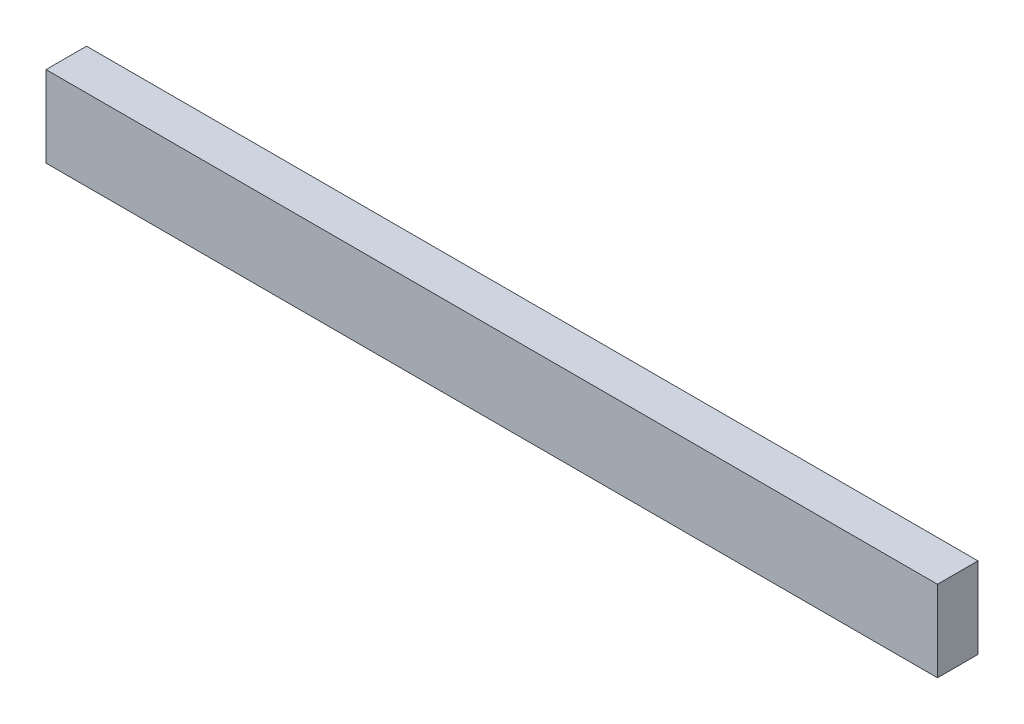
ISO-10303-21;
HEADER;
FILE_DESCRIPTION(('STEP AP214'),'2;1');
FILE_NAME('part.step','',(''),(''),'','','');
FILE_SCHEMA(('AUTOMOTIVE_DESIGN { 1 0 10303 214 1 1 1 1 }'));
ENDSEC;
DATA;
#1=APPLICATION_CONTEXT('core data for automotive mechanical design processes');
#2=APPLICATION_PROTOCOL_DEFINITION('international standard','automotive_design',2000,#1);
#3=PRODUCT_CONTEXT('',#1,'mechanical');
#4=PRODUCT('Part','Part','',(#3));
#5=PRODUCT_RELATED_PRODUCT_CATEGORY('part','',(#4));
#6=PRODUCT_DEFINITION_FORMATION('','',#4);
#7=PRODUCT_DEFINITION_CONTEXT('part definition',#1,'design');
#8=PRODUCT_DEFINITION('design','',#6,#7);
#9=PRODUCT_DEFINITION_SHAPE('','',#8);
#10=(LENGTH_UNIT() NAMED_UNIT(*) SI_UNIT(.MILLI.,.METRE.));
#11=(NAMED_UNIT(*) PLANE_ANGLE_UNIT() SI_UNIT($,.RADIAN.));
#12=(NAMED_UNIT(*) SI_UNIT($,.STERADIAN.) SOLID_ANGLE_UNIT());
#13=UNCERTAINTY_MEASURE_WITH_UNIT(LENGTH_MEASURE(1.E-05),#10,'distance_accuracy_value','');
#14=(GEOMETRIC_REPRESENTATION_CONTEXT(3) GLOBAL_UNCERTAINTY_ASSIGNED_CONTEXT((#13)) GLOBAL_UNIT_ASSIGNED_CONTEXT((#10,
#11,#12)) REPRESENTATION_CONTEXT('',''));
#15=CARTESIAN_POINT('',(0.,0.,0.));
#16=DIRECTION('',(0.,0.,1.));
#17=DIRECTION('',(1.,0.,0.));
#18=AXIS2_PLACEMENT_3D('',#15,#16,#17);
#19=CARTESIAN_POINT('',(34.925,-3.175,3.175));
#20=DIRECTION('',(-1.,0.,0.));
#21=DIRECTION('',(0.,0.,1.));
#22=AXIS2_PLACEMENT_3D('',#19,#20,#21);
#23=PLANE('',#22);
#24=DIRECTION('',(0.,1.,0.));
#25=VECTOR('',#24,1.);
#26=CARTESIAN_POINT('',(34.925,-3.175,0.));
#27=LINE('',#26,#25);
#28=CARTESIAN_POINT('',(34.925,-3.175,0.));
#29=VERTEX_POINT('',#28);
#30=CARTESIAN_POINT('',(34.925,3.175,0.));
#31=VERTEX_POINT('',#30);
#32=EDGE_CURVE('E102',#29,#31,#27,.T.);
#33=ORIENTED_EDGE('',*,*,#32,.T.);
#34=DIRECTION('',(0.,0.,-1.));
#35=VECTOR('',#34,1.);
#36=CARTESIAN_POINT('',(34.925,3.175,3.175));
#37=LINE('',#36,#35);
#38=CARTESIAN_POINT('',(34.925,3.175,3.175));
#39=VERTEX_POINT('',#38);
#40=EDGE_CURVE('E11',#39,#31,#37,.T.);
#41=ORIENTED_EDGE('',*,*,#40,.F.);
#42=DIRECTION('',(0.,1.,0.));
#43=VECTOR('',#42,1.);
#44=CARTESIAN_POINT('',(34.925,-3.175,3.175));
#45=LINE('',#44,#43);
#46=CARTESIAN_POINT('',(34.925,-3.175,3.175));
#47=VERTEX_POINT('',#46);
#48=EDGE_CURVE('E90',#47,#39,#45,.T.);
#49=ORIENTED_EDGE('',*,*,#48,.F.);
#50=DIRECTION('',(0.,0.,-1.));
#51=VECTOR('',#50,1.);
#52=CARTESIAN_POINT('',(34.925,-3.175,3.175));
#53=LINE('',#52,#51);
#54=EDGE_CURVE('E98',#47,#29,#53,.T.);
#55=ORIENTED_EDGE('',*,*,#54,.T.);
#56=EDGE_LOOP('',(#33,#41,#49,#55));
#57=FACE_BOUND('',#56,.T.);
#58=ADVANCED_FACE('F39',(#57),#23,.F.);
#59=CARTESIAN_POINT('',(-34.925,3.175,3.175));
#60=DIRECTION('',(0.,-1.,0.));
#61=DIRECTION('',(0.,0.,-1.));
#62=AXIS2_PLACEMENT_3D('',#59,#60,#61);
#63=PLANE('',#62);
#64=DIRECTION('',(-1.,0.,0.));
#65=VECTOR('',#64,1.);
#66=CARTESIAN_POINT('',(-34.925,3.175,0.));
#67=LINE('',#66,#65);
#68=CARTESIAN_POINT('',(-34.925,3.175,0.));
#69=VERTEX_POINT('',#68);
#70=EDGE_CURVE('E94',#31,#69,#67,.T.);
#71=ORIENTED_EDGE('',*,*,#70,.T.);
#72=DIRECTION('',(0.,0.,-1.));
#73=VECTOR('',#72,1.);
#74=CARTESIAN_POINT('',(-34.925,3.175,3.175));
#75=LINE('',#74,#73);
#76=CARTESIAN_POINT('',(-34.925,3.175,3.175));
#77=VERTEX_POINT('',#76);
#78=EDGE_CURVE('E47',#77,#69,#75,.T.);
#79=ORIENTED_EDGE('',*,*,#78,.F.);
#80=DIRECTION('',(-1.,0.,0.));
#81=VECTOR('',#80,1.);
#82=CARTESIAN_POINT('',(-34.925,3.175,3.175));
#83=LINE('',#82,#81);
#84=EDGE_CURVE('E85',#39,#77,#83,.T.);
#85=ORIENTED_EDGE('',*,*,#84,.F.);
#86=ORIENTED_EDGE('',*,*,#40,.T.);
#87=EDGE_LOOP('',(#71,#79,#85,#86));
#88=FACE_BOUND('',#87,.T.);
#89=ADVANCED_FACE('F93',(#88),#63,.F.);
#90=CARTESIAN_POINT('',(-34.925,-3.175,3.175));
#91=DIRECTION('',(1.,0.,0.));
#92=DIRECTION('',(0.,0.,-1.));
#93=AXIS2_PLACEMENT_3D('',#90,#91,#92);
#94=PLANE('',#93);
#95=DIRECTION('',(0.,-1.,0.));
#96=VECTOR('',#95,1.);
#97=CARTESIAN_POINT('',(-34.925,-3.175,0.));
#98=LINE('',#97,#96);
#99=CARTESIAN_POINT('',(-34.925,-3.175,0.));
#100=VERTEX_POINT('',#99);
#101=EDGE_CURVE('E72',#69,#100,#98,.T.);
#102=ORIENTED_EDGE('',*,*,#101,.T.);
#103=DIRECTION('',(0.,0.,-1.));
#104=VECTOR('',#103,1.);
#105=CARTESIAN_POINT('',(-34.925,-3.175,3.175));
#106=LINE('',#105,#104);
#107=CARTESIAN_POINT('',(-34.925,-3.175,3.175));
#108=VERTEX_POINT('',#107);
#109=EDGE_CURVE('E95',#108,#100,#106,.T.);
#110=ORIENTED_EDGE('',*,*,#109,.F.);
#111=DIRECTION('',(0.,-1.,0.));
#112=VECTOR('',#111,1.);
#113=CARTESIAN_POINT('',(-34.925,-3.175,3.175));
#114=LINE('',#113,#112);
#115=EDGE_CURVE('E88',#77,#108,#114,.T.);
#116=ORIENTED_EDGE('',*,*,#115,.F.);
#117=ORIENTED_EDGE('',*,*,#78,.T.);
#118=EDGE_LOOP('',(#102,#110,#116,#117));
#119=FACE_BOUND('',#118,.T.);
#120=ADVANCED_FACE('F96',(#119),#94,.F.);
#121=CARTESIAN_POINT('',(-34.925,-3.175,3.175));
#122=DIRECTION('',(0.,1.,0.));
#123=DIRECTION('',(0.,0.,1.));
#124=AXIS2_PLACEMENT_3D('',#121,#122,#123);
#125=PLANE('',#124);
#126=DIRECTION('',(1.,0.,0.));
#127=VECTOR('',#126,1.);
#128=CARTESIAN_POINT('',(-34.925,-3.175,0.));
#129=LINE('',#128,#127);
#130=EDGE_CURVE('E78',#100,#29,#129,.T.);
#131=ORIENTED_EDGE('',*,*,#130,.T.);
#132=ORIENTED_EDGE('',*,*,#54,.F.);
#133=DIRECTION('',(1.,0.,0.));
#134=VECTOR('',#133,1.);
#135=CARTESIAN_POINT('',(-34.925,-3.175,3.175));
#136=LINE('',#135,#134);
#137=EDGE_CURVE('E55',#108,#47,#136,.T.);
#138=ORIENTED_EDGE('',*,*,#137,.F.);
#139=ORIENTED_EDGE('',*,*,#109,.T.);
#140=EDGE_LOOP('',(#131,#132,#138,#139));
#141=FACE_BOUND('',#140,.T.);
#142=ADVANCED_FACE('F109',(#141),#125,.F.);
#143=CARTESIAN_POINT('',(0.,0.,3.175));
#144=DIRECTION('',(0.,0.,-1.));
#145=DIRECTION('',(-1.,0.,0.));
#146=AXIS2_PLACEMENT_3D('',#143,#144,#145);
#147=PLANE('',#146);
#148=ORIENTED_EDGE('',*,*,#48,.T.);
#149=ORIENTED_EDGE('',*,*,#84,.T.);
#150=ORIENTED_EDGE('',*,*,#115,.T.);
#151=ORIENTED_EDGE('',*,*,#137,.T.);
#152=EDGE_LOOP('',(#148,#149,#150,#151));
#153=FACE_BOUND('',#152,.T.);
#154=ADVANCED_FACE('F86',(#153),#147,.F.);
#155=CARTESIAN_POINT('',(0.,0.,0.));
#156=DIRECTION('',(0.,0.,-1.));
#157=DIRECTION('',(-1.,0.,0.));
#158=AXIS2_PLACEMENT_3D('',#155,#156,#157);
#159=PLANE('',#158);
#160=ORIENTED_EDGE('',*,*,#32,.F.);
#161=ORIENTED_EDGE('',*,*,#130,.F.);
#162=ORIENTED_EDGE('',*,*,#101,.F.);
#163=ORIENTED_EDGE('',*,*,#70,.F.);
#164=EDGE_LOOP('',(#160,#161,#162,#163));
#165=FACE_BOUND('',#164,.T.);
#166=ADVANCED_FACE('F112',(#165),#159,.T.);
#167=CLOSED_SHELL('',(#58,#89,#120,#142,#154,#166));
#168=MANIFOLD_SOLID_BREP('B2',#167);
#169=ADVANCED_BREP_SHAPE_REPRESENTATION('',(#18,#168),#14);
#170=SHAPE_DEFINITION_REPRESENTATION(#9,#169);
ENDSEC;
END-ISO-10303-21;
